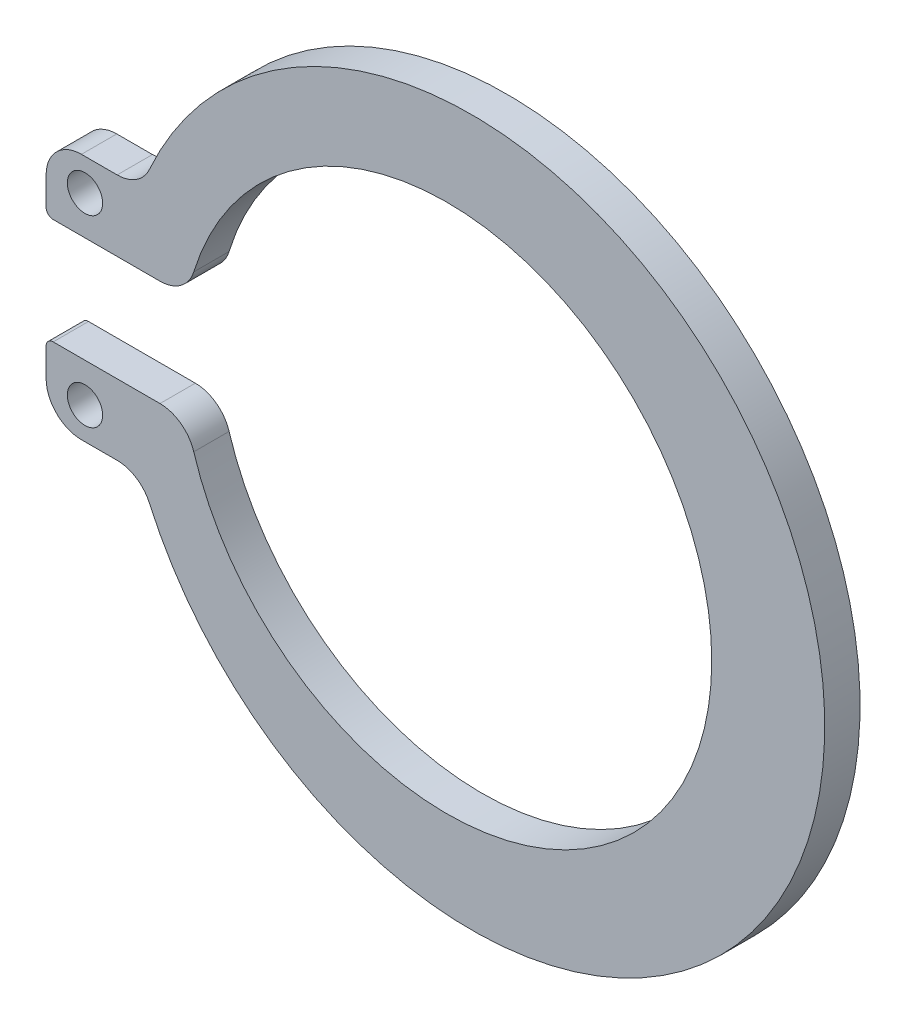
ISO-10303-21;
HEADER;
FILE_DESCRIPTION(('STEP AP214'),'2;1');
FILE_NAME('part.step','',(''),(''),'','','');
FILE_SCHEMA(('AUTOMOTIVE_DESIGN { 1 0 10303 214 1 1 1 1 }'));
ENDSEC;
DATA;
#1=APPLICATION_CONTEXT('core data for automotive mechanical design processes');
#2=APPLICATION_PROTOCOL_DEFINITION('international standard','automotive_design',2000,#1);
#3=PRODUCT_CONTEXT('',#1,'mechanical');
#4=PRODUCT('Part','Part','',(#3));
#5=PRODUCT_RELATED_PRODUCT_CATEGORY('part','',(#4));
#6=PRODUCT_DEFINITION_FORMATION('','',#4);
#7=PRODUCT_DEFINITION_CONTEXT('part definition',#1,'design');
#8=PRODUCT_DEFINITION('design','',#6,#7);
#9=PRODUCT_DEFINITION_SHAPE('','',#8);
#10=(LENGTH_UNIT() NAMED_UNIT(*) SI_UNIT(.MILLI.,.METRE.));
#11=(NAMED_UNIT(*) PLANE_ANGLE_UNIT() SI_UNIT($,.RADIAN.));
#12=(NAMED_UNIT(*) SI_UNIT($,.STERADIAN.) SOLID_ANGLE_UNIT());
#13=UNCERTAINTY_MEASURE_WITH_UNIT(LENGTH_MEASURE(1.E-05),#10,'distance_accuracy_value','');
#14=(GEOMETRIC_REPRESENTATION_CONTEXT(3) GLOBAL_UNCERTAINTY_ASSIGNED_CONTEXT((#13)) GLOBAL_UNIT_ASSIGNED_CONTEXT((#10,
#11,#12)) REPRESENTATION_CONTEXT('',''));
#15=CARTESIAN_POINT('',(0.,0.,0.));
#16=DIRECTION('',(0.,0.,1.));
#17=DIRECTION('',(1.,0.,0.));
#18=AXIS2_PLACEMENT_3D('',#15,#16,#17);
#19=CARTESIAN_POINT('',(-5.67423461417477,0.749999999999998,0.5));
#20=DIRECTION('',(1.,0.,0.));
#21=DIRECTION('',(0.,0.,-1.));
#22=AXIS2_PLACEMENT_3D('',#19,#20,#21);
#23=PLANE('',#22);
#24=DIRECTION('',(0.,-1.,0.));
#25=VECTOR('',#24,1.);
#26=CARTESIAN_POINT('',(-5.67423461417477,0.749999999999998,0.));
#27=LINE('',#26,#25);
#28=CARTESIAN_POINT('',(-5.67423461417477,1.25,0.));
#29=VERTEX_POINT('',#28);
#30=CARTESIAN_POINT('',(-5.67423461417477,0.849999999999998,0.));
#31=VERTEX_POINT('',#30);
#32=EDGE_CURVE('E328',#29,#31,#27,.T.);
#33=ORIENTED_EDGE('',*,*,#32,.T.);
#34=DIRECTION('',(0.,0.,-1.));
#35=VECTOR('',#34,1.);
#36=CARTESIAN_POINT('',(-5.67423461417477,0.849999999999998,0.5));
#37=LINE('',#36,#35);
#38=CARTESIAN_POINT('',(-5.67423461417477,0.849999999999998,0.5));
#39=VERTEX_POINT('',#38);
#40=EDGE_CURVE('E247',#31,#39,#37,.F.);
#41=ORIENTED_EDGE('',*,*,#40,.T.);
#42=DIRECTION('',(0.,-1.,0.));
#43=VECTOR('',#42,1.);
#44=CARTESIAN_POINT('',(-5.67423461417477,0.749999999999998,0.5));
#45=LINE('',#44,#43);
#46=CARTESIAN_POINT('',(-5.67423461417477,1.25,0.5));
#47=VERTEX_POINT('',#46);
#48=EDGE_CURVE('E192',#47,#39,#45,.T.);
#49=ORIENTED_EDGE('',*,*,#48,.F.);
#50=DIRECTION('',(0.,0.,-1.));
#51=VECTOR('',#50,1.);
#52=CARTESIAN_POINT('',(-5.67423461417477,1.25,0.5));
#53=LINE('',#52,#51);
#54=EDGE_CURVE('E209',#47,#29,#53,.T.);
#55=ORIENTED_EDGE('',*,*,#54,.T.);
#56=EDGE_LOOP('',(#33,#41,#49,#55));
#57=FACE_BOUND('',#56,.T.);
#58=ADVANCED_FACE('F39',(#57),#23,.F.);
#59=CARTESIAN_POINT('',(-3.67423461417477,0.749999999999998,0.5));
#60=DIRECTION('',(0.,1.,0.));
#61=DIRECTION('',(0.,0.,1.));
#62=AXIS2_PLACEMENT_3D('',#59,#60,#61);
#63=PLANE('',#62);
#64=DIRECTION('',(1.,0.,0.));
#65=VECTOR('',#64,1.);
#66=CARTESIAN_POINT('',(-3.67423461417477,0.749999999999998,0.5));
#67=LINE('',#66,#65);
#68=CARTESIAN_POINT('',(-5.57423461417477,0.749999999999998,0.5));
#69=VERTEX_POINT('',#68);
#70=CARTESIAN_POINT('',(-4.06201920231798,0.749999999999998,0.5));
#71=VERTEX_POINT('',#70);
#72=EDGE_CURVE('E345',#69,#71,#67,.T.);
#73=ORIENTED_EDGE('',*,*,#72,.F.);
#74=DIRECTION('',(0.,0.,-1.));
#75=VECTOR('',#74,1.);
#76=CARTESIAN_POINT('',(-5.57423461417477,0.749999999999998,0.5));
#77=LINE('',#76,#75);
#78=CARTESIAN_POINT('',(-5.57423461417477,0.749999999999998,0.));
#79=VERTEX_POINT('',#78);
#80=EDGE_CURVE('E240',#69,#79,#77,.T.);
#81=ORIENTED_EDGE('',*,*,#80,.T.);
#82=DIRECTION('',(1.,0.,0.));
#83=VECTOR('',#82,1.);
#84=CARTESIAN_POINT('',(-3.67423461417477,0.749999999999998,0.));
#85=LINE('',#84,#83);
#86=CARTESIAN_POINT('',(-4.06201920231798,0.749999999999998,0.));
#87=VERTEX_POINT('',#86);
#88=EDGE_CURVE('E330',#79,#87,#85,.T.);
#89=ORIENTED_EDGE('',*,*,#88,.T.);
#90=DIRECTION('',(0.,0.,-1.));
#91=VECTOR('',#90,1.);
#92=CARTESIAN_POINT('',(-4.06201920231798,0.749999999999998,0.5));
#93=LINE('',#92,#91);
#94=EDGE_CURVE('E230',#87,#71,#93,.F.);
#95=ORIENTED_EDGE('',*,*,#94,.T.);
#96=EDGE_LOOP('',(#73,#81,#89,#95));
#97=FACE_BOUND('',#96,.T.);
#98=ADVANCED_FACE('F275',(#97),#63,.F.);
#99=CARTESIAN_POINT('',(0.,0.,0.5));
#100=DIRECTION('',(0.,0.,-1.));
#101=DIRECTION('',(-1.,0.,0.));
#102=AXIS2_PLACEMENT_3D('',#99,#100,#101);
#103=CYLINDRICAL_SURFACE('',#102,3.75);
#104=CARTESIAN_POINT('',(0.,0.,0.));
#105=DIRECTION('',(0.,0.,-1.));
#106=DIRECTION('',(1.,0.,0.));
#107=AXIS2_PLACEMENT_3D('',#104,#105,#106);
#108=CIRCLE('',#107,3.75);
#109=CARTESIAN_POINT('',(-3.58413459028057,1.10294117647059,0.));
#110=VERTEX_POINT('',#109);
#111=CARTESIAN_POINT('',(-3.58413459028057,-1.10294117647059,0.));
#112=VERTEX_POINT('',#111);
#113=EDGE_CURVE('E260',#110,#112,#108,.T.);
#114=ORIENTED_EDGE('',*,*,#113,.T.);
#115=DIRECTION('',(0.,0.,-1.));
#116=VECTOR('',#115,1.);
#117=CARTESIAN_POINT('',(-3.58413459028057,-1.10294117647059,0.5));
#118=LINE('',#117,#116);
#119=CARTESIAN_POINT('',(-3.58413459028057,-1.10294117647059,0.5));
#120=VERTEX_POINT('',#119);
#121=EDGE_CURVE('E228',#112,#120,#118,.F.);
#122=ORIENTED_EDGE('',*,*,#121,.T.);
#123=CARTESIAN_POINT('',(0.,0.,0.5));
#124=DIRECTION('',(0.,0.,-1.));
#125=DIRECTION('',(1.,0.,0.));
#126=AXIS2_PLACEMENT_3D('',#123,#124,#125);
#127=CIRCLE('',#126,3.75);
#128=CARTESIAN_POINT('',(-3.58413459028057,1.10294117647059,0.5));
#129=VERTEX_POINT('',#128);
#130=EDGE_CURVE('E342',#129,#120,#127,.T.);
#131=ORIENTED_EDGE('',*,*,#130,.F.);
#132=DIRECTION('',(0.,0.,-1.));
#133=VECTOR('',#132,1.);
#134=CARTESIAN_POINT('',(-3.58413459028057,1.10294117647059,0.5));
#135=LINE('',#134,#133);
#136=EDGE_CURVE('E225',#129,#110,#135,.T.);
#137=ORIENTED_EDGE('',*,*,#136,.T.);
#138=EDGE_LOOP('',(#114,#122,#131,#137));
#139=FACE_BOUND('',#138,.T.);
#140=ADVANCED_FACE('F282',(#139),#103,.F.);
#141=CARTESIAN_POINT('',(-3.67423461417477,-0.750000000000002,0.5));
#142=DIRECTION('',(0.,-1.,0.));
#143=DIRECTION('',(1.,0.,0.));
#144=AXIS2_PLACEMENT_3D('',#141,#142,#143);
#145=PLANE('',#144);
#146=DIRECTION('',(-1.,0.,0.));
#147=VECTOR('',#146,1.);
#148=CARTESIAN_POINT('',(-3.67423461417477,-0.750000000000002,0.));
#149=LINE('',#148,#147);
#150=CARTESIAN_POINT('',(-4.06201920231798,-0.750000000000002,0.));
#151=VERTEX_POINT('',#150);
#152=CARTESIAN_POINT('',(-5.57423461417477,-0.750000000000003,0.));
#153=VERTEX_POINT('',#152);
#154=EDGE_CURVE('E186',#151,#153,#149,.T.);
#155=ORIENTED_EDGE('',*,*,#154,.T.);
#156=DIRECTION('',(0.,0.,-1.));
#157=VECTOR('',#156,1.);
#158=CARTESIAN_POINT('',(-5.57423461417477,-0.750000000000003,0.5));
#159=LINE('',#158,#157);
#160=CARTESIAN_POINT('',(-5.57423461417477,-0.750000000000003,0.5));
#161=VERTEX_POINT('',#160);
#162=EDGE_CURVE('E11',#153,#161,#159,.F.);
#163=ORIENTED_EDGE('',*,*,#162,.T.);
#164=DIRECTION('',(-1.,0.,0.));
#165=VECTOR('',#164,1.);
#166=CARTESIAN_POINT('',(-3.67423461417477,-0.750000000000002,0.5));
#167=LINE('',#166,#165);
#168=CARTESIAN_POINT('',(-4.06201920231798,-0.750000000000002,0.5));
#169=VERTEX_POINT('',#168);
#170=EDGE_CURVE('E341',#169,#161,#167,.T.);
#171=ORIENTED_EDGE('',*,*,#170,.F.);
#172=DIRECTION('',(0.,0.,-1.));
#173=VECTOR('',#172,1.);
#174=CARTESIAN_POINT('',(-4.06201920231798,-0.750000000000002,0.5));
#175=LINE('',#174,#173);
#176=EDGE_CURVE('E222',#169,#151,#175,.T.);
#177=ORIENTED_EDGE('',*,*,#176,.T.);
#178=EDGE_LOOP('',(#155,#163,#171,#177));
#179=FACE_BOUND('',#178,.T.);
#180=ADVANCED_FACE('F258',(#179),#145,.F.);
#181=CARTESIAN_POINT('',(-5.67423461417477,-0.750000000000003,0.5));
#182=DIRECTION('',(1.,0.,0.));
#183=DIRECTION('',(0.,1.,0.));
#184=AXIS2_PLACEMENT_3D('',#181,#182,#183);
#185=PLANE('',#184);
#186=DIRECTION('',(0.,-1.,0.));
#187=VECTOR('',#186,1.);
#188=CARTESIAN_POINT('',(-5.67423461417477,-0.750000000000003,0.5));
#189=LINE('',#188,#187);
#190=CARTESIAN_POINT('',(-5.67423461417477,-0.850000000000003,0.5));
#191=VERTEX_POINT('',#190);
#192=CARTESIAN_POINT('',(-5.67423461417477,-1.25,0.5));
#193=VERTEX_POINT('',#192);
#194=EDGE_CURVE('E255',#191,#193,#189,.T.);
#195=ORIENTED_EDGE('',*,*,#194,.F.);
#196=DIRECTION('',(0.,0.,-1.));
#197=VECTOR('',#196,1.);
#198=CARTESIAN_POINT('',(-5.67423461417477,-0.850000000000003,0.5));
#199=LINE('',#198,#197);
#200=CARTESIAN_POINT('',(-5.67423461417477,-0.850000000000003,0.));
#201=VERTEX_POINT('',#200);
#202=EDGE_CURVE('E47',#191,#201,#199,.T.);
#203=ORIENTED_EDGE('',*,*,#202,.T.);
#204=DIRECTION('',(0.,-1.,0.));
#205=VECTOR('',#204,1.);
#206=CARTESIAN_POINT('',(-5.67423461417477,-0.750000000000003,0.));
#207=LINE('',#206,#205);
#208=CARTESIAN_POINT('',(-5.67423461417477,-1.25,0.));
#209=VERTEX_POINT('',#208);
#210=EDGE_CURVE('E181',#201,#209,#207,.T.);
#211=ORIENTED_EDGE('',*,*,#210,.T.);
#212=DIRECTION('',(0.,0.,-1.));
#213=VECTOR('',#212,1.);
#214=CARTESIAN_POINT('',(-5.67423461417477,-1.25,0.5));
#215=LINE('',#214,#213);
#216=EDGE_CURVE('E159',#209,#193,#215,.F.);
#217=ORIENTED_EDGE('',*,*,#216,.T.);
#218=EDGE_LOOP('',(#195,#203,#211,#217));
#219=FACE_BOUND('',#218,.T.);
#220=ADVANCED_FACE('F254',(#219),#185,.F.);
#221=CARTESIAN_POINT('',(-4.3337484987988,-1.75,0.5));
#222=DIRECTION('',(0.,1.,0.));
#223=DIRECTION('',(-1.,0.,0.));
#224=AXIS2_PLACEMENT_3D('',#221,#222,#223);
#225=PLANE('',#224);
#226=DIRECTION('',(1.,0.,0.));
#227=VECTOR('',#226,1.);
#228=CARTESIAN_POINT('',(-4.3337484987988,-1.75,0.5));
#229=LINE('',#228,#227);
#230=CARTESIAN_POINT('',(-5.17423461417477,-1.75,0.5));
#231=VERTEX_POINT('',#230);
#232=CARTESIAN_POINT('',(-4.66871497497118,-1.75,0.5));
#233=VERTEX_POINT('',#232);
#234=EDGE_CURVE('E172',#231,#233,#229,.T.);
#235=ORIENTED_EDGE('',*,*,#234,.F.);
#236=DIRECTION('',(0.,0.,-1.));
#237=VECTOR('',#236,1.);
#238=CARTESIAN_POINT('',(-5.17423461417477,-1.75,0.5));
#239=LINE('',#238,#237);
#240=CARTESIAN_POINT('',(-5.17423461417477,-1.75,0.));
#241=VERTEX_POINT('',#240);
#242=EDGE_CURVE('E157',#231,#241,#239,.T.);
#243=ORIENTED_EDGE('',*,*,#242,.T.);
#244=DIRECTION('',(1.,0.,0.));
#245=VECTOR('',#244,1.);
#246=CARTESIAN_POINT('',(-4.3337484987988,-1.75,0.));
#247=LINE('',#246,#245);
#248=CARTESIAN_POINT('',(-4.66871497497118,-1.75,0.));
#249=VERTEX_POINT('',#248);
#250=EDGE_CURVE('E169',#241,#249,#247,.T.);
#251=ORIENTED_EDGE('',*,*,#250,.T.);
#252=DIRECTION('',(0.,0.,1.));
#253=VECTOR('',#252,1.);
#254=CARTESIAN_POINT('',(-4.66871497497118,-1.75,0.5));
#255=LINE('',#254,#253);
#256=EDGE_CURVE('E174',#249,#233,#255,.T.);
#257=ORIENTED_EDGE('',*,*,#256,.T.);
#258=EDGE_LOOP('',(#235,#243,#251,#257));
#259=FACE_BOUND('',#258,.T.);
#260=ADVANCED_FACE('F168',(#259),#225,.F.);
#261=CARTESIAN_POINT('',(0.35,0.,0.5));
#262=DIRECTION('',(0.,0.,-1.));
#263=DIRECTION('',(-1.,0.,0.));
#264=AXIS2_PLACEMENT_3D('',#261,#262,#263);
#265=CYLINDRICAL_SURFACE('',#264,5.);
#266=CARTESIAN_POINT('',(0.35,0.,0.5));
#267=DIRECTION('',(0.,0.,1.));
#268=DIRECTION('',(1.,0.,0.));
#269=AXIS2_PLACEMENT_3D('',#266,#267,#268);
#270=CIRCLE('',#269,5.);
#271=CARTESIAN_POINT('',(-4.21246815906471,-2.04545454545455,0.5));
#272=VERTEX_POINT('',#271);
#273=CARTESIAN_POINT('',(-4.21246815906471,2.04545454545454,0.5));
#274=VERTEX_POINT('',#273);
#275=EDGE_CURVE('E319',#272,#274,#270,.T.);
#276=ORIENTED_EDGE('',*,*,#275,.F.);
#277=DIRECTION('',(0.,0.,-1.));
#278=VECTOR('',#277,1.);
#279=CARTESIAN_POINT('',(-4.21246815906471,-2.04545454545455,0.5));
#280=LINE('',#279,#278);
#281=CARTESIAN_POINT('',(-4.21246815906471,-2.04545454545455,0.));
#282=VERTEX_POINT('',#281);
#283=EDGE_CURVE('E219',#272,#282,#280,.T.);
#284=ORIENTED_EDGE('',*,*,#283,.T.);
#285=CARTESIAN_POINT('',(0.35,0.,0.));
#286=DIRECTION('',(0.,0.,1.));
#287=DIRECTION('',(1.,0.,0.));
#288=AXIS2_PLACEMENT_3D('',#285,#286,#287);
#289=CIRCLE('',#288,5.);
#290=CARTESIAN_POINT('',(-4.21246815906471,2.04545454545454,0.));
#291=VERTEX_POINT('',#290);
#292=EDGE_CURVE('E180',#282,#291,#289,.T.);
#293=ORIENTED_EDGE('',*,*,#292,.T.);
#294=DIRECTION('',(0.,0.,-1.));
#295=VECTOR('',#294,1.);
#296=CARTESIAN_POINT('',(-4.21246815906471,2.04545454545454,0.5));
#297=LINE('',#296,#295);
#298=EDGE_CURVE('E217',#291,#274,#297,.F.);
#299=ORIENTED_EDGE('',*,*,#298,.T.);
#300=EDGE_LOOP('',(#276,#284,#293,#299));
#301=FACE_BOUND('',#300,.T.);
#302=ADVANCED_FACE('F351',(#301),#265,.T.);
#303=CARTESIAN_POINT('',(-4.3337484987988,1.75,0.5));
#304=DIRECTION('',(0.,-1.,0.));
#305=DIRECTION('',(1.,0.,0.));
#306=AXIS2_PLACEMENT_3D('',#303,#304,#305);
#307=PLANE('',#306);
#308=DIRECTION('',(-1.,0.,0.));
#309=VECTOR('',#308,1.);
#310=CARTESIAN_POINT('',(-4.3337484987988,1.75,0.));
#311=LINE('',#310,#309);
#312=CARTESIAN_POINT('',(-4.66871497497118,1.75,0.));
#313=VERTEX_POINT('',#312);
#314=CARTESIAN_POINT('',(-5.17423461417477,1.75,0.));
#315=VERTEX_POINT('',#314);
#316=EDGE_CURVE('E184',#313,#315,#311,.T.);
#317=ORIENTED_EDGE('',*,*,#316,.T.);
#318=DIRECTION('',(0.,0.,-1.));
#319=VECTOR('',#318,1.);
#320=CARTESIAN_POINT('',(-5.17423461417477,1.75,0.5));
#321=LINE('',#320,#319);
#322=CARTESIAN_POINT('',(-5.17423461417477,1.75,0.5));
#323=VERTEX_POINT('',#322);
#324=EDGE_CURVE('E215',#315,#323,#321,.F.);
#325=ORIENTED_EDGE('',*,*,#324,.T.);
#326=DIRECTION('',(-1.,0.,0.));
#327=VECTOR('',#326,1.);
#328=CARTESIAN_POINT('',(-4.3337484987988,1.75,0.5));
#329=LINE('',#328,#327);
#330=CARTESIAN_POINT('',(-4.66871497497118,1.75,0.5));
#331=VERTEX_POINT('',#330);
#332=EDGE_CURVE('E193',#331,#323,#329,.T.);
#333=ORIENTED_EDGE('',*,*,#332,.F.);
#334=DIRECTION('',(0.,0.,1.));
#335=VECTOR('',#334,1.);
#336=CARTESIAN_POINT('',(-4.66871497497118,1.75,0.));
#337=LINE('',#336,#335);
#338=EDGE_CURVE('E212',#331,#313,#337,.F.);
#339=ORIENTED_EDGE('',*,*,#338,.T.);
#340=EDGE_LOOP('',(#317,#325,#333,#339));
#341=FACE_BOUND('',#340,.T.);
#342=ADVANCED_FACE('F321',(#341),#307,.F.);
#343=CARTESIAN_POINT('',(0.35,0.,0.5));
#344=DIRECTION('',(0.,0.,1.));
#345=DIRECTION('',(1.,0.,0.));
#346=AXIS2_PLACEMENT_3D('',#343,#344,#345);
#347=PLANE('',#346);
#348=CARTESIAN_POINT('',(-5.12423461417477,1.3,0.5));
#349=DIRECTION('',(0.,0.,1.));
#350=DIRECTION('',(1.,0.,0.));
#351=AXIS2_PLACEMENT_3D('',#348,#349,#350);
#352=CIRCLE('',#351,0.25);
#353=CARTESIAN_POINT('',(-4.87423461417477,1.3,0.5));
#354=VERTEX_POINT('',#353);
#355=EDGE_CURVE('E362',#354,#354,#352,.T.);
#356=ORIENTED_EDGE('',*,*,#355,.F.);
#357=EDGE_LOOP('',(#356));
#358=FACE_BOUND('',#357,.T.);
#359=CARTESIAN_POINT('',(-5.12423461417477,-1.3,0.5));
#360=DIRECTION('',(0.,0.,1.));
#361=DIRECTION('',(1.,0.,0.));
#362=AXIS2_PLACEMENT_3D('',#359,#360,#361);
#363=CIRCLE('',#362,0.25);
#364=CARTESIAN_POINT('',(-4.87423461417477,-1.3,0.5));
#365=VERTEX_POINT('',#364);
#366=EDGE_CURVE('E363',#365,#365,#363,.T.);
#367=ORIENTED_EDGE('',*,*,#366,.F.);
#368=EDGE_LOOP('',(#367));
#369=FACE_BOUND('',#368,.T.);
#370=ORIENTED_EDGE('',*,*,#48,.T.);
#371=CARTESIAN_POINT('',(-5.57423461417477,0.849999999999998,0.5));
#372=DIRECTION('',(0.,0.,1.));
#373=DIRECTION('',(1.,0.,0.));
#374=AXIS2_PLACEMENT_3D('',#371,#372,#373);
#375=CIRCLE('',#374,0.1);
#376=EDGE_CURVE('E250',#39,#69,#375,.T.);
#377=ORIENTED_EDGE('',*,*,#376,.T.);
#378=ORIENTED_EDGE('',*,*,#72,.T.);
#379=CARTESIAN_POINT('',(-4.06201920231798,1.25,0.5));
#380=DIRECTION('',(0.,0.,1.));
#381=DIRECTION('',(1.,0.,0.));
#382=AXIS2_PLACEMENT_3D('',#379,#380,#381);
#383=CIRCLE('',#382,0.5);
#384=EDGE_CURVE('E201',#71,#129,#383,.T.);
#385=ORIENTED_EDGE('',*,*,#384,.T.);
#386=ORIENTED_EDGE('',*,*,#130,.T.);
#387=CARTESIAN_POINT('',(-4.06201920231798,-1.25,0.5));
#388=DIRECTION('',(0.,0.,1.));
#389=DIRECTION('',(1.,0.,0.));
#390=AXIS2_PLACEMENT_3D('',#387,#388,#389);
#391=CIRCLE('',#390,0.5);
#392=EDGE_CURVE('E203',#120,#169,#391,.T.);
#393=ORIENTED_EDGE('',*,*,#392,.T.);
#394=ORIENTED_EDGE('',*,*,#170,.T.);
#395=CARTESIAN_POINT('',(-5.57423461417477,-0.850000000000003,0.5));
#396=DIRECTION('',(0.,0.,1.));
#397=DIRECTION('',(1.,0.,0.));
#398=AXIS2_PLACEMENT_3D('',#395,#396,#397);
#399=CIRCLE('',#398,0.1);
#400=EDGE_CURVE('E59',#161,#191,#399,.T.);
#401=ORIENTED_EDGE('',*,*,#400,.T.);
#402=ORIENTED_EDGE('',*,*,#194,.T.);
#403=CARTESIAN_POINT('',(-5.17423461417477,-1.25,0.5));
#404=DIRECTION('',(0.,0.,1.));
#405=DIRECTION('',(1.,0.,0.));
#406=AXIS2_PLACEMENT_3D('',#403,#404,#405);
#407=CIRCLE('',#406,0.5);
#408=EDGE_CURVE('E207',#193,#231,#407,.T.);
#409=ORIENTED_EDGE('',*,*,#408,.T.);
#410=ORIENTED_EDGE('',*,*,#234,.T.);
#411=CARTESIAN_POINT('',(-4.66871497497118,-2.25,0.5));
#412=DIRECTION('',(0.,0.,1.));
#413=DIRECTION('',(1.,0.,0.));
#414=AXIS2_PLACEMENT_3D('',#411,#412,#413);
#415=CIRCLE('',#414,0.5);
#416=EDGE_CURVE('E234',#233,#272,#415,.F.);
#417=ORIENTED_EDGE('',*,*,#416,.T.);
#418=ORIENTED_EDGE('',*,*,#275,.T.);
#419=CARTESIAN_POINT('',(-4.66871497497118,2.25,0.5));
#420=DIRECTION('',(0.,0.,1.));
#421=DIRECTION('',(1.,0.,0.));
#422=AXIS2_PLACEMENT_3D('',#419,#420,#421);
#423=CIRCLE('',#422,0.5);
#424=EDGE_CURVE('E238',#274,#331,#423,.F.);
#425=ORIENTED_EDGE('',*,*,#424,.T.);
#426=ORIENTED_EDGE('',*,*,#332,.T.);
#427=CARTESIAN_POINT('',(-5.17423461417477,1.25,0.5));
#428=DIRECTION('',(0.,0.,1.));
#429=DIRECTION('',(1.,0.,0.));
#430=AXIS2_PLACEMENT_3D('',#427,#428,#429);
#431=CIRCLE('',#430,0.5);
#432=EDGE_CURVE('E205',#323,#47,#431,.T.);
#433=ORIENTED_EDGE('',*,*,#432,.T.);
#434=EDGE_LOOP('',(#370,#377,#378,#385,#386,#393,#394,#401,#402,#409,#410,#417,#418,#425,#426,#433));
#435=FACE_BOUND('',#434,.T.);
#436=ADVANCED_FACE('F316',(#358,#369,#435),#347,.T.);
#437=CARTESIAN_POINT('',(0.35,0.,0.));
#438=DIRECTION('',(0.,0.,1.));
#439=DIRECTION('',(1.,0.,0.));
#440=AXIS2_PLACEMENT_3D('',#437,#438,#439);
#441=PLANE('',#440);
#442=CARTESIAN_POINT('',(-5.12423461417477,1.3,0.));
#443=DIRECTION('',(0.,0.,1.));
#444=DIRECTION('',(1.,0.,0.));
#445=AXIS2_PLACEMENT_3D('',#442,#443,#444);
#446=CIRCLE('',#445,0.25);
#447=CARTESIAN_POINT('',(-4.87423461417477,1.3,0.));
#448=VERTEX_POINT('',#447);
#449=EDGE_CURVE('E331',#448,#448,#446,.F.);
#450=ORIENTED_EDGE('',*,*,#449,.F.);
#451=EDGE_LOOP('',(#450));
#452=FACE_BOUND('',#451,.T.);
#453=CARTESIAN_POINT('',(-5.12423461417477,-1.3,0.));
#454=DIRECTION('',(0.,0.,1.));
#455=DIRECTION('',(1.,0.,0.));
#456=AXIS2_PLACEMENT_3D('',#453,#454,#455);
#457=CIRCLE('',#456,0.25);
#458=CARTESIAN_POINT('',(-4.87423461417477,-1.3,0.));
#459=VERTEX_POINT('',#458);
#460=EDGE_CURVE('E359',#459,#459,#457,.F.);
#461=ORIENTED_EDGE('',*,*,#460,.F.);
#462=EDGE_LOOP('',(#461));
#463=FACE_BOUND('',#462,.T.);
#464=ORIENTED_EDGE('',*,*,#88,.F.);
#465=CARTESIAN_POINT('',(-5.57423461417477,0.849999999999998,0.));
#466=DIRECTION('',(0.,0.,1.));
#467=DIRECTION('',(1.,0.,0.));
#468=AXIS2_PLACEMENT_3D('',#465,#466,#467);
#469=CIRCLE('',#468,0.1);
#470=EDGE_CURVE('E245',#79,#31,#469,.F.);
#471=ORIENTED_EDGE('',*,*,#470,.T.);
#472=ORIENTED_EDGE('',*,*,#32,.F.);
#473=CARTESIAN_POINT('',(-5.17423461417477,1.25,0.));
#474=DIRECTION('',(0.,0.,1.));
#475=DIRECTION('',(1.,0.,0.));
#476=AXIS2_PLACEMENT_3D('',#473,#474,#475);
#477=CIRCLE('',#476,0.5);
#478=EDGE_CURVE('E163',#29,#315,#477,.F.);
#479=ORIENTED_EDGE('',*,*,#478,.T.);
#480=ORIENTED_EDGE('',*,*,#316,.F.);
#481=CARTESIAN_POINT('',(-4.66871497497118,2.25,0.));
#482=DIRECTION('',(0.,0.,1.));
#483=DIRECTION('',(1.,0.,0.));
#484=AXIS2_PLACEMENT_3D('',#481,#482,#483);
#485=CIRCLE('',#484,0.5);
#486=EDGE_CURVE('E236',#313,#291,#485,.T.);
#487=ORIENTED_EDGE('',*,*,#486,.T.);
#488=ORIENTED_EDGE('',*,*,#292,.F.);
#489=CARTESIAN_POINT('',(-4.66871497497118,-2.25,0.));
#490=DIRECTION('',(0.,0.,1.));
#491=DIRECTION('',(1.,0.,0.));
#492=AXIS2_PLACEMENT_3D('',#489,#490,#491);
#493=CIRCLE('',#492,0.5);
#494=EDGE_CURVE('E179',#282,#249,#493,.T.);
#495=ORIENTED_EDGE('',*,*,#494,.T.);
#496=ORIENTED_EDGE('',*,*,#250,.F.);
#497=CARTESIAN_POINT('',(-5.17423461417477,-1.25,0.));
#498=DIRECTION('',(0.,0.,1.));
#499=DIRECTION('',(1.,0.,0.));
#500=AXIS2_PLACEMENT_3D('',#497,#498,#499);
#501=CIRCLE('',#500,0.5);
#502=EDGE_CURVE('E153',#241,#209,#501,.F.);
#503=ORIENTED_EDGE('',*,*,#502,.T.);
#504=ORIENTED_EDGE('',*,*,#210,.F.);
#505=CARTESIAN_POINT('',(-5.57423461417477,-0.850000000000003,0.));
#506=DIRECTION('',(0.,0.,1.));
#507=DIRECTION('',(1.,0.,0.));
#508=AXIS2_PLACEMENT_3D('',#505,#506,#507);
#509=CIRCLE('',#508,0.1);
#510=EDGE_CURVE('E243',#201,#153,#509,.F.);
#511=ORIENTED_EDGE('',*,*,#510,.T.);
#512=ORIENTED_EDGE('',*,*,#154,.F.);
#513=CARTESIAN_POINT('',(-4.06201920231798,-1.25,0.));
#514=DIRECTION('',(0.,0.,1.));
#515=DIRECTION('',(1.,0.,0.));
#516=AXIS2_PLACEMENT_3D('',#513,#514,#515);
#517=CIRCLE('',#516,0.5);
#518=EDGE_CURVE('E197',#151,#112,#517,.F.);
#519=ORIENTED_EDGE('',*,*,#518,.T.);
#520=ORIENTED_EDGE('',*,*,#113,.F.);
#521=CARTESIAN_POINT('',(-4.06201920231798,1.25,0.));
#522=DIRECTION('',(0.,0.,1.));
#523=DIRECTION('',(1.,0.,0.));
#524=AXIS2_PLACEMENT_3D('',#521,#522,#523);
#525=CIRCLE('',#524,0.5);
#526=EDGE_CURVE('E173',#110,#87,#525,.F.);
#527=ORIENTED_EDGE('',*,*,#526,.T.);
#528=EDGE_LOOP('',(#464,#471,#472,#479,#480,#487,#488,#495,#496,#503,#504,#511,#512,#519,#520,#527));
#529=FACE_BOUND('',#528,.T.);
#530=ADVANCED_FACE('F177',(#452,#463,#529),#441,.F.);
#531=CARTESIAN_POINT('',(-5.17423461417477,-1.25,0.5));
#532=DIRECTION('',(0.,0.,-1.));
#533=DIRECTION('',(-1.,0.,0.));
#534=AXIS2_PLACEMENT_3D('',#531,#532,#533);
#535=CYLINDRICAL_SURFACE('',#534,0.5);
#536=ORIENTED_EDGE('',*,*,#408,.F.);
#537=ORIENTED_EDGE('',*,*,#216,.F.);
#538=ORIENTED_EDGE('',*,*,#502,.F.);
#539=ORIENTED_EDGE('',*,*,#242,.F.);
#540=EDGE_LOOP('',(#536,#537,#538,#539));
#541=FACE_BOUND('',#540,.T.);
#542=ADVANCED_FACE('F156',(#541),#535,.T.);
#543=CARTESIAN_POINT('',(-5.17423461417477,1.25,0.5));
#544=DIRECTION('',(0.,0.,-1.));
#545=DIRECTION('',(-1.,0.,0.));
#546=AXIS2_PLACEMENT_3D('',#543,#544,#545);
#547=CYLINDRICAL_SURFACE('',#546,0.5);
#548=ORIENTED_EDGE('',*,*,#432,.F.);
#549=ORIENTED_EDGE('',*,*,#324,.F.);
#550=ORIENTED_EDGE('',*,*,#478,.F.);
#551=ORIENTED_EDGE('',*,*,#54,.F.);
#552=EDGE_LOOP('',(#548,#549,#550,#551));
#553=FACE_BOUND('',#552,.T.);
#554=ADVANCED_FACE('F290',(#553),#547,.T.);
#555=CARTESIAN_POINT('',(-4.66871497497118,-2.25,0.5));
#556=DIRECTION('',(0.,0.,-1.));
#557=DIRECTION('',(-1.,0.,0.));
#558=AXIS2_PLACEMENT_3D('',#555,#556,#557);
#559=CYLINDRICAL_SURFACE('',#558,0.5);
#560=ORIENTED_EDGE('',*,*,#416,.F.);
#561=ORIENTED_EDGE('',*,*,#256,.F.);
#562=ORIENTED_EDGE('',*,*,#494,.F.);
#563=ORIENTED_EDGE('',*,*,#283,.F.);
#564=EDGE_LOOP('',(#560,#561,#562,#563));
#565=FACE_BOUND('',#564,.T.);
#566=ADVANCED_FACE('F293',(#565),#559,.F.);
#567=CARTESIAN_POINT('',(-4.06201920231798,-1.25,0.5));
#568=DIRECTION('',(0.,0.,-1.));
#569=DIRECTION('',(-1.,0.,0.));
#570=AXIS2_PLACEMENT_3D('',#567,#568,#569);
#571=CYLINDRICAL_SURFACE('',#570,0.5);
#572=ORIENTED_EDGE('',*,*,#392,.F.);
#573=ORIENTED_EDGE('',*,*,#121,.F.);
#574=ORIENTED_EDGE('',*,*,#518,.F.);
#575=ORIENTED_EDGE('',*,*,#176,.F.);
#576=EDGE_LOOP('',(#572,#573,#574,#575));
#577=FACE_BOUND('',#576,.T.);
#578=ADVANCED_FACE('F297',(#577),#571,.T.);
#579=CARTESIAN_POINT('',(-4.06201920231798,1.25,0.5));
#580=DIRECTION('',(0.,0.,-1.));
#581=DIRECTION('',(-1.,0.,0.));
#582=AXIS2_PLACEMENT_3D('',#579,#580,#581);
#583=CYLINDRICAL_SURFACE('',#582,0.5);
#584=ORIENTED_EDGE('',*,*,#384,.F.);
#585=ORIENTED_EDGE('',*,*,#94,.F.);
#586=ORIENTED_EDGE('',*,*,#526,.F.);
#587=ORIENTED_EDGE('',*,*,#136,.F.);
#588=EDGE_LOOP('',(#584,#585,#586,#587));
#589=FACE_BOUND('',#588,.T.);
#590=ADVANCED_FACE('F301',(#589),#583,.T.);
#591=CARTESIAN_POINT('',(-4.66871497497118,2.25,0.5));
#592=DIRECTION('',(0.,0.,-1.));
#593=DIRECTION('',(-1.,0.,0.));
#594=AXIS2_PLACEMENT_3D('',#591,#592,#593);
#595=CYLINDRICAL_SURFACE('',#594,0.5);
#596=ORIENTED_EDGE('',*,*,#424,.F.);
#597=ORIENTED_EDGE('',*,*,#298,.F.);
#598=ORIENTED_EDGE('',*,*,#486,.F.);
#599=ORIENTED_EDGE('',*,*,#338,.F.);
#600=EDGE_LOOP('',(#596,#597,#598,#599));
#601=FACE_BOUND('',#600,.T.);
#602=ADVANCED_FACE('F272',(#601),#595,.F.);
#603=CARTESIAN_POINT('',(-5.57423461417477,0.849999999999998,0.5));
#604=DIRECTION('',(0.,0.,-1.));
#605=DIRECTION('',(-1.,0.,0.));
#606=AXIS2_PLACEMENT_3D('',#603,#604,#605);
#607=CYLINDRICAL_SURFACE('',#606,0.1);
#608=ORIENTED_EDGE('',*,*,#376,.F.);
#609=ORIENTED_EDGE('',*,*,#40,.F.);
#610=ORIENTED_EDGE('',*,*,#470,.F.);
#611=ORIENTED_EDGE('',*,*,#80,.F.);
#612=EDGE_LOOP('',(#608,#609,#610,#611));
#613=FACE_BOUND('',#612,.T.);
#614=ADVANCED_FACE('F263',(#613),#607,.T.);
#615=CARTESIAN_POINT('',(-5.57423461417477,-0.850000000000003,0.5));
#616=DIRECTION('',(0.,0.,-1.));
#617=DIRECTION('',(-1.,0.,0.));
#618=AXIS2_PLACEMENT_3D('',#615,#616,#617);
#619=CYLINDRICAL_SURFACE('',#618,0.1);
#620=ORIENTED_EDGE('',*,*,#400,.F.);
#621=ORIENTED_EDGE('',*,*,#162,.F.);
#622=ORIENTED_EDGE('',*,*,#510,.F.);
#623=ORIENTED_EDGE('',*,*,#202,.F.);
#624=EDGE_LOOP('',(#620,#621,#622,#623));
#625=FACE_BOUND('',#624,.T.);
#626=ADVANCED_FACE('F41',(#625),#619,.T.);
#627=CARTESIAN_POINT('',(-5.12423461417477,-1.3,-0.00100000000000002));
#628=DIRECTION('',(0.,0.,1.));
#629=DIRECTION('',(1.,0.,0.));
#630=AXIS2_PLACEMENT_3D('',#627,#628,#629);
#631=CYLINDRICAL_SURFACE('',#630,0.25);
#632=ORIENTED_EDGE('',*,*,#366,.T.);
#633=EDGE_LOOP('',(#632));
#634=FACE_BOUND('',#633,.T.);
#635=ORIENTED_EDGE('',*,*,#460,.T.);
#636=EDGE_LOOP('',(#635));
#637=FACE_BOUND('',#636,.T.);
#638=ADVANCED_FACE('F262',(#634,#637),#631,.F.);
#639=CARTESIAN_POINT('',(-5.12423461417477,1.3,-0.00100000000000002));
#640=DIRECTION('',(0.,0.,1.));
#641=DIRECTION('',(1.,0.,0.));
#642=AXIS2_PLACEMENT_3D('',#639,#640,#641);
#643=CYLINDRICAL_SURFACE('',#642,0.25);
#644=ORIENTED_EDGE('',*,*,#355,.T.);
#645=EDGE_LOOP('',(#644));
#646=FACE_BOUND('',#645,.T.);
#647=ORIENTED_EDGE('',*,*,#449,.T.);
#648=EDGE_LOOP('',(#647));
#649=FACE_BOUND('',#648,.T.);
#650=ADVANCED_FACE('F269',(#646,#649),#643,.F.);
#651=CLOSED_SHELL('',(#58,#98,#140,#180,#220,#260,#302,#342,#436,#530,#542,#554,#566,#578,#590,
#602,#614,#626,#638,#650));
#652=MANIFOLD_SOLID_BREP('B2',#651);
#653=ADVANCED_BREP_SHAPE_REPRESENTATION('',(#18,#652),#14);
#654=SHAPE_DEFINITION_REPRESENTATION(#9,#653);
ENDSEC;
END-ISO-10303-21;
